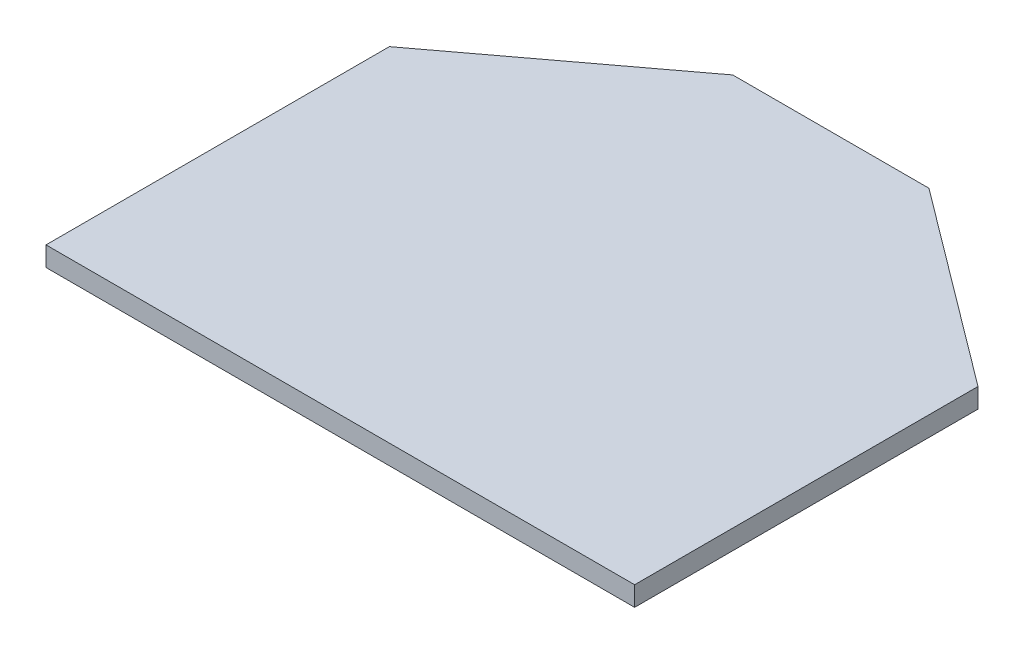
ISO-10303-21;
HEADER;
FILE_DESCRIPTION(('STEP AP214'),'2;1');
FILE_NAME('part.step','',(''),(''),'','','');
FILE_SCHEMA(('AUTOMOTIVE_DESIGN { 1 0 10303 214 1 1 1 1 }'));
ENDSEC;
DATA;
#1=APPLICATION_CONTEXT('core data for automotive mechanical design processes');
#2=APPLICATION_PROTOCOL_DEFINITION('international standard','automotive_design',2000,#1);
#3=PRODUCT_CONTEXT('',#1,'mechanical');
#4=PRODUCT('Part','Part','',(#3));
#5=PRODUCT_RELATED_PRODUCT_CATEGORY('part','',(#4));
#6=PRODUCT_DEFINITION_FORMATION('','',#4);
#7=PRODUCT_DEFINITION_CONTEXT('part definition',#1,'design');
#8=PRODUCT_DEFINITION('design','',#6,#7);
#9=PRODUCT_DEFINITION_SHAPE('','',#8);
#10=(LENGTH_UNIT() NAMED_UNIT(*) SI_UNIT(.MILLI.,.METRE.));
#11=(NAMED_UNIT(*) PLANE_ANGLE_UNIT() SI_UNIT($,.RADIAN.));
#12=(NAMED_UNIT(*) SI_UNIT($,.STERADIAN.) SOLID_ANGLE_UNIT());
#13=UNCERTAINTY_MEASURE_WITH_UNIT(LENGTH_MEASURE(1.E-05),#10,'distance_accuracy_value','');
#14=(GEOMETRIC_REPRESENTATION_CONTEXT(3) GLOBAL_UNCERTAINTY_ASSIGNED_CONTEXT((#13)) GLOBAL_UNIT_ASSIGNED_CONTEXT((#10,
#11,#12)) REPRESENTATION_CONTEXT('',''));
#15=CARTESIAN_POINT('',(0.,0.,0.));
#16=DIRECTION('',(0.,0.,1.));
#17=DIRECTION('',(1.,0.,0.));
#18=AXIS2_PLACEMENT_3D('',#15,#16,#17);
#19=CARTESIAN_POINT('',(-90.,6.,92.5));
#20=DIRECTION('',(1.,0.,0.));
#21=DIRECTION('',(0.,0.,-1.));
#22=AXIS2_PLACEMENT_3D('',#19,#20,#21);
#23=PLANE('',#22);
#24=DIRECTION('',(0.,0.,1.));
#25=VECTOR('',#24,1.);
#26=CARTESIAN_POINT('',(-90.,0.,92.5));
#27=LINE('',#26,#25);
#28=CARTESIAN_POINT('',(-90.,0.,-12.5));
#29=VERTEX_POINT('',#28);
#30=CARTESIAN_POINT('',(-90.,0.,92.5));
#31=VERTEX_POINT('',#30);
#32=EDGE_CURVE('E117',#29,#31,#27,.T.);
#33=ORIENTED_EDGE('',*,*,#32,.T.);
#34=DIRECTION('',(0.,-1.,0.));
#35=VECTOR('',#34,1.);
#36=CARTESIAN_POINT('',(-90.,6.,92.5));
#37=LINE('',#36,#35);
#38=CARTESIAN_POINT('',(-90.,6.,92.5));
#39=VERTEX_POINT('',#38);
#40=EDGE_CURVE('E11',#39,#31,#37,.T.);
#41=ORIENTED_EDGE('',*,*,#40,.F.);
#42=DIRECTION('',(0.,0.,1.));
#43=VECTOR('',#42,1.);
#44=CARTESIAN_POINT('',(-90.,6.,92.5));
#45=LINE('',#44,#43);
#46=CARTESIAN_POINT('',(-90.,6.,-12.5));
#47=VERTEX_POINT('',#46);
#48=EDGE_CURVE('E127',#47,#39,#45,.T.);
#49=ORIENTED_EDGE('',*,*,#48,.F.);
#50=DIRECTION('',(0.,-1.,0.));
#51=VECTOR('',#50,1.);
#52=CARTESIAN_POINT('',(-90.,6.,-12.5));
#53=LINE('',#52,#51);
#54=EDGE_CURVE('E113',#47,#29,#53,.T.);
#55=ORIENTED_EDGE('',*,*,#54,.T.);
#56=EDGE_LOOP('',(#33,#41,#49,#55));
#57=FACE_BOUND('',#56,.T.);
#58=ADVANCED_FACE('F33',(#57),#23,.F.);
#59=CARTESIAN_POINT('',(-90.,6.,92.5));
#60=DIRECTION('',(0.,0.,-1.));
#61=DIRECTION('',(-1.,0.,0.));
#62=AXIS2_PLACEMENT_3D('',#59,#60,#61);
#63=PLANE('',#62);
#64=DIRECTION('',(1.,0.,0.));
#65=VECTOR('',#64,1.);
#66=CARTESIAN_POINT('',(-90.,0.,92.5));
#67=LINE('',#66,#65);
#68=CARTESIAN_POINT('',(90.,0.,92.5));
#69=VERTEX_POINT('',#68);
#70=EDGE_CURVE('E120',#31,#69,#67,.T.);
#71=ORIENTED_EDGE('',*,*,#70,.T.);
#72=DIRECTION('',(0.,-1.,0.));
#73=VECTOR('',#72,1.);
#74=CARTESIAN_POINT('',(90.,6.,92.5));
#75=LINE('',#74,#73);
#76=CARTESIAN_POINT('',(90.,6.,92.5));
#77=VERTEX_POINT('',#76);
#78=EDGE_CURVE('E41',#77,#69,#75,.T.);
#79=ORIENTED_EDGE('',*,*,#78,.F.);
#80=DIRECTION('',(1.,0.,0.));
#81=VECTOR('',#80,1.);
#82=CARTESIAN_POINT('',(-90.,6.,92.5));
#83=LINE('',#82,#81);
#84=EDGE_CURVE('E86',#39,#77,#83,.T.);
#85=ORIENTED_EDGE('',*,*,#84,.F.);
#86=ORIENTED_EDGE('',*,*,#40,.T.);
#87=EDGE_LOOP('',(#71,#79,#85,#86));
#88=FACE_BOUND('',#87,.T.);
#89=ADVANCED_FACE('F151',(#88),#63,.F.);
#90=CARTESIAN_POINT('',(90.,6.,92.5));
#91=DIRECTION('',(-1.,0.,0.));
#92=DIRECTION('',(0.,0.,1.));
#93=AXIS2_PLACEMENT_3D('',#90,#91,#92);
#94=PLANE('',#93);
#95=DIRECTION('',(0.,0.,-1.));
#96=VECTOR('',#95,1.);
#97=CARTESIAN_POINT('',(90.,0.,92.5));
#98=LINE('',#97,#96);
#99=CARTESIAN_POINT('',(90.,0.,-12.5));
#100=VERTEX_POINT('',#99);
#101=EDGE_CURVE('E122',#69,#100,#98,.T.);
#102=ORIENTED_EDGE('',*,*,#101,.T.);
#103=DIRECTION('',(0.,-1.,0.));
#104=VECTOR('',#103,1.);
#105=CARTESIAN_POINT('',(90.,6.,-12.5));
#106=LINE('',#105,#104);
#107=CARTESIAN_POINT('',(90.,6.,-12.5));
#108=VERTEX_POINT('',#107);
#109=EDGE_CURVE('E108',#108,#100,#106,.T.);
#110=ORIENTED_EDGE('',*,*,#109,.F.);
#111=DIRECTION('',(0.,0.,-1.));
#112=VECTOR('',#111,1.);
#113=CARTESIAN_POINT('',(90.,6.,92.5));
#114=LINE('',#113,#112);
#115=EDGE_CURVE('E99',#77,#108,#114,.T.);
#116=ORIENTED_EDGE('',*,*,#115,.F.);
#117=ORIENTED_EDGE('',*,*,#78,.T.);
#118=EDGE_LOOP('',(#102,#110,#116,#117));
#119=FACE_BOUND('',#118,.T.);
#120=ADVANCED_FACE('F133',(#119),#94,.F.);
#121=CARTESIAN_POINT('',(30.,6.,-57.5));
#122=DIRECTION('',(-0.6,0.,0.8));
#123=DIRECTION('',(0.8,0.,0.6));
#124=AXIS2_PLACEMENT_3D('',#121,#122,#123);
#125=PLANE('',#124);
#126=DIRECTION('',(-0.8,0.,-0.6));
#127=VECTOR('',#126,1.);
#128=CARTESIAN_POINT('',(30.,0.,-57.5));
#129=LINE('',#128,#127);
#130=CARTESIAN_POINT('',(30.,0.,-57.5));
#131=VERTEX_POINT('',#130);
#132=EDGE_CURVE('E107',#100,#131,#129,.T.);
#133=ORIENTED_EDGE('',*,*,#132,.T.);
#134=DIRECTION('',(0.,-1.,0.));
#135=VECTOR('',#134,1.);
#136=CARTESIAN_POINT('',(30.,6.,-57.5));
#137=LINE('',#136,#135);
#138=CARTESIAN_POINT('',(30.,6.,-57.5));
#139=VERTEX_POINT('',#138);
#140=EDGE_CURVE('E104',#139,#131,#137,.T.);
#141=ORIENTED_EDGE('',*,*,#140,.F.);
#142=DIRECTION('',(-0.8,0.,-0.6));
#143=VECTOR('',#142,1.);
#144=CARTESIAN_POINT('',(30.,6.,-57.5));
#145=LINE('',#144,#143);
#146=EDGE_CURVE('E93',#108,#139,#145,.T.);
#147=ORIENTED_EDGE('',*,*,#146,.F.);
#148=ORIENTED_EDGE('',*,*,#109,.T.);
#149=EDGE_LOOP('',(#133,#141,#147,#148));
#150=FACE_BOUND('',#149,.T.);
#151=ADVANCED_FACE('F105',(#150),#125,.F.);
#152=CARTESIAN_POINT('',(-30.,6.,-57.5));
#153=DIRECTION('',(0.,0.,1.));
#154=DIRECTION('',(1.,0.,0.));
#155=AXIS2_PLACEMENT_3D('',#152,#153,#154);
#156=PLANE('',#155);
#157=DIRECTION('',(-1.,0.,0.));
#158=VECTOR('',#157,1.);
#159=CARTESIAN_POINT('',(-30.,0.,-57.5));
#160=LINE('',#159,#158);
#161=CARTESIAN_POINT('',(-30.,0.,-57.5));
#162=VERTEX_POINT('',#161);
#163=EDGE_CURVE('E72',#131,#162,#160,.T.);
#164=ORIENTED_EDGE('',*,*,#163,.T.);
#165=DIRECTION('',(0.,-1.,0.));
#166=VECTOR('',#165,1.);
#167=CARTESIAN_POINT('',(-30.,6.,-57.5));
#168=LINE('',#167,#166);
#169=CARTESIAN_POINT('',(-30.,6.,-57.5));
#170=VERTEX_POINT('',#169);
#171=EDGE_CURVE('E109',#170,#162,#168,.T.);
#172=ORIENTED_EDGE('',*,*,#171,.F.);
#173=DIRECTION('',(-1.,0.,0.));
#174=VECTOR('',#173,1.);
#175=CARTESIAN_POINT('',(-30.,6.,-57.5));
#176=LINE('',#175,#174);
#177=EDGE_CURVE('E97',#139,#170,#176,.T.);
#178=ORIENTED_EDGE('',*,*,#177,.F.);
#179=ORIENTED_EDGE('',*,*,#140,.T.);
#180=EDGE_LOOP('',(#164,#172,#178,#179));
#181=FACE_BOUND('',#180,.T.);
#182=ADVANCED_FACE('F111',(#181),#156,.F.);
#183=CARTESIAN_POINT('',(-90.,6.,-12.5));
#184=DIRECTION('',(0.6,0.,0.8));
#185=DIRECTION('',(0.8,0.,-0.6));
#186=AXIS2_PLACEMENT_3D('',#183,#184,#185);
#187=PLANE('',#186);
#188=DIRECTION('',(-0.8,0.,0.6));
#189=VECTOR('',#188,1.);
#190=CARTESIAN_POINT('',(-90.,0.,-12.5));
#191=LINE('',#190,#189);
#192=EDGE_CURVE('E78',#162,#29,#191,.T.);
#193=ORIENTED_EDGE('',*,*,#192,.T.);
#194=ORIENTED_EDGE('',*,*,#54,.F.);
#195=DIRECTION('',(-0.8,0.,0.6));
#196=VECTOR('',#195,1.);
#197=CARTESIAN_POINT('',(-90.,6.,-12.5));
#198=LINE('',#197,#196);
#199=EDGE_CURVE('E49',#170,#47,#198,.T.);
#200=ORIENTED_EDGE('',*,*,#199,.F.);
#201=ORIENTED_EDGE('',*,*,#171,.T.);
#202=EDGE_LOOP('',(#193,#194,#200,#201));
#203=FACE_BOUND('',#202,.T.);
#204=ADVANCED_FACE('F140',(#203),#187,.F.);
#205=CARTESIAN_POINT('',(0.,6.,0.));
#206=DIRECTION('',(0.,-1.,0.));
#207=DIRECTION('',(0.,0.,-1.));
#208=AXIS2_PLACEMENT_3D('',#205,#206,#207);
#209=PLANE('',#208);
#210=ORIENTED_EDGE('',*,*,#48,.T.);
#211=ORIENTED_EDGE('',*,*,#84,.T.);
#212=ORIENTED_EDGE('',*,*,#115,.T.);
#213=ORIENTED_EDGE('',*,*,#146,.T.);
#214=ORIENTED_EDGE('',*,*,#177,.T.);
#215=ORIENTED_EDGE('',*,*,#199,.T.);
#216=EDGE_LOOP('',(#210,#211,#212,#213,#214,#215));
#217=FACE_BOUND('',#216,.T.);
#218=ADVANCED_FACE('F95',(#217),#209,.F.);
#219=CARTESIAN_POINT('',(0.,0.,0.));
#220=DIRECTION('',(0.,-1.,0.));
#221=DIRECTION('',(0.,0.,-1.));
#222=AXIS2_PLACEMENT_3D('',#219,#220,#221);
#223=PLANE('',#222);
#224=ORIENTED_EDGE('',*,*,#32,.F.);
#225=ORIENTED_EDGE('',*,*,#192,.F.);
#226=ORIENTED_EDGE('',*,*,#163,.F.);
#227=ORIENTED_EDGE('',*,*,#132,.F.);
#228=ORIENTED_EDGE('',*,*,#101,.F.);
#229=ORIENTED_EDGE('',*,*,#70,.F.);
#230=EDGE_LOOP('',(#224,#225,#226,#227,#228,#229));
#231=FACE_BOUND('',#230,.T.);
#232=ADVANCED_FACE('F136',(#231),#223,.T.);
#233=CLOSED_SHELL('',(#58,#89,#120,#151,#182,#204,#218,#232));
#234=MANIFOLD_SOLID_BREP('B2',#233);
#235=ADVANCED_BREP_SHAPE_REPRESENTATION('',(#18,#234),#14);
#236=SHAPE_DEFINITION_REPRESENTATION(#9,#235);
ENDSEC;
END-ISO-10303-21;
